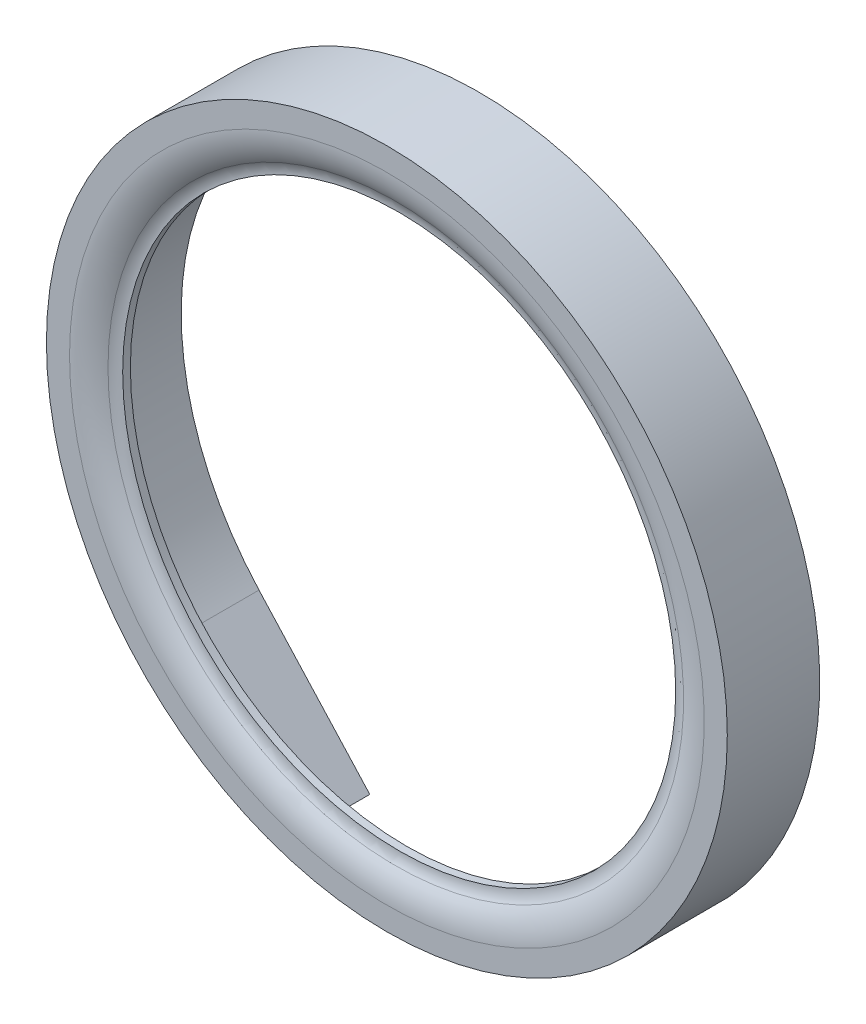
ISO-10303-21;
HEADER;
FILE_DESCRIPTION(('STEP AP214'),'2;1');
FILE_NAME('part.step','',(''),(''),'','','');
FILE_SCHEMA(('AUTOMOTIVE_DESIGN { 1 0 10303 214 1 1 1 1 }'));
ENDSEC;
DATA;
#1=APPLICATION_CONTEXT('core data for automotive mechanical design processes');
#2=APPLICATION_PROTOCOL_DEFINITION('international standard','automotive_design',2000,#1);
#3=PRODUCT_CONTEXT('',#1,'mechanical');
#4=PRODUCT('Part','Part','',(#3));
#5=PRODUCT_RELATED_PRODUCT_CATEGORY('part','',(#4));
#6=PRODUCT_DEFINITION_FORMATION('','',#4);
#7=PRODUCT_DEFINITION_CONTEXT('part definition',#1,'design');
#8=PRODUCT_DEFINITION('design','',#6,#7);
#9=PRODUCT_DEFINITION_SHAPE('','',#8);
#10=(LENGTH_UNIT() NAMED_UNIT(*) SI_UNIT(.MILLI.,.METRE.));
#11=(NAMED_UNIT(*) PLANE_ANGLE_UNIT() SI_UNIT($,.RADIAN.));
#12=(NAMED_UNIT(*) SI_UNIT($,.STERADIAN.) SOLID_ANGLE_UNIT());
#13=UNCERTAINTY_MEASURE_WITH_UNIT(LENGTH_MEASURE(1.E-05),#10,'distance_accuracy_value','');
#14=(GEOMETRIC_REPRESENTATION_CONTEXT(3) GLOBAL_UNCERTAINTY_ASSIGNED_CONTEXT((#13)) GLOBAL_UNIT_ASSIGNED_CONTEXT((#10,
#11,#12)) REPRESENTATION_CONTEXT('',''));
#15=CARTESIAN_POINT('',(0.,0.,0.));
#16=DIRECTION('',(0.,0.,1.));
#17=DIRECTION('',(1.,0.,0.));
#18=AXIS2_PLACEMENT_3D('',#15,#16,#17);
#19=CARTESIAN_POINT('',(0.,0.,2.82379327467158));
#20=DIRECTION('',(0.,0.,-1.));
#21=DIRECTION('',(-1.,0.,0.));
#22=AXIS2_PLACEMENT_3D('',#19,#20,#21);
#23=TOROIDAL_SURFACE('',#22,17.95,1.32379327467158);
#24=CARTESIAN_POINT('',(0.,0.,1.72113610330566));
#25=DIRECTION('',(0.,0.,-1.));
#26=DIRECTION('',(-1.,0.,0.));
#27=AXIS2_PLACEMENT_3D('',#24,#25,#26);
#28=CIRCLE('',#27,18.6825133422);
#29=CARTESIAN_POINT('',(-18.6825133422,0.,1.72113610330566));
#30=VERTEX_POINT('',#29);
#31=EDGE_CURVE('E116',#30,#30,#28,.T.);
#32=ORIENTED_EDGE('',*,*,#31,.F.);
#33=EDGE_LOOP('',(#32));
#34=FACE_BOUND('',#33,.T.);
#35=CARTESIAN_POINT('',(0.,0.,1.5));
#36=DIRECTION('',(0.,0.,-1.));
#37=DIRECTION('',(-1.,0.,0.));
#38=AXIS2_PLACEMENT_3D('',#35,#36,#37);
#39=CIRCLE('',#38,17.95);
#40=CARTESIAN_POINT('',(-17.95,0.,1.5));
#41=VERTEX_POINT('',#40);
#42=EDGE_CURVE('E129',#41,#41,#39,.T.);
#43=ORIENTED_EDGE('',*,*,#42,.T.);
#44=EDGE_LOOP('',(#43));
#45=FACE_BOUND('',#44,.T.);
#46=ADVANCED_FACE('F41',(#34,#45),#23,.F.);
#47=CARTESIAN_POINT('',(0.,0.,-23.2424672863447));
#48=DIRECTION('',(0.,0.,-1.));
#49=DIRECTION('',(-1.,0.,0.));
#50=AXIS2_PLACEMENT_3D('',#47,#48,#49);
#51=CYLINDRICAL_SURFACE('',#50,17.95);
#52=CARTESIAN_POINT('',(0.,0.,1.));
#53=DIRECTION('',(0.,0.,1.));
#54=DIRECTION('',(1.,0.,0.));
#55=AXIS2_PLACEMENT_3D('',#52,#53,#54);
#56=CIRCLE('',#55,17.95);
#57=CARTESIAN_POINT('',(17.95,0.,1.));
#58=VERTEX_POINT('',#57);
#59=EDGE_CURVE('E115',#58,#58,#56,.F.);
#60=ORIENTED_EDGE('',*,*,#59,.T.);
#61=EDGE_LOOP('',(#60));
#62=FACE_BOUND('',#61,.T.);
#63=ORIENTED_EDGE('',*,*,#42,.F.);
#64=EDGE_LOOP('',(#63));
#65=FACE_BOUND('',#64,.T.);
#66=ADVANCED_FACE('F151',(#62,#65),#51,.F.);
#67=CARTESIAN_POINT('',(17.95,0.,-3.7));
#68=DIRECTION('',(0.,0.,1.));
#69=DIRECTION('',(1.,0.,0.));
#70=AXIS2_PLACEMENT_3D('',#67,#68,#69);
#71=PLANE('',#70);
#72=CARTESIAN_POINT('',(-17.6236169670133,-10.1750000000001,-3.7));
#73=DIRECTION('',(0.,0.,-1.));
#74=DIRECTION('',(0.500000000000004,-0.866025403784436,0.));
#75=AXIS2_PLACEMENT_3D('',#72,#73,#74);
#76=CIRCLE('',#75,0.900000000000002);
#77=CARTESIAN_POINT('',(-17.1736169670133,-10.9544228634061,-3.7));
#78=VERTEX_POINT('',#77);
#79=EDGE_CURVE('E209',#78,#78,#76,.T.);
#80=ORIENTED_EDGE('',*,*,#79,.F.);
#81=EDGE_LOOP('',(#80));
#82=FACE_BOUND('',#81,.T.);
#83=CARTESIAN_POINT('',(17.6236169670134,-10.1749999999998,-3.7));
#84=DIRECTION('',(0.,0.,-1.));
#85=DIRECTION('',(0.499999999999992,0.866025403784443,0.));
#86=AXIS2_PLACEMENT_3D('',#83,#84,#85);
#87=CIRCLE('',#86,0.900000000000002);
#88=CARTESIAN_POINT('',(18.0736169670134,-9.39557713659384,-3.7));
#89=VERTEX_POINT('',#88);
#90=EDGE_CURVE('E216',#89,#89,#87,.T.);
#91=ORIENTED_EDGE('',*,*,#90,.F.);
#92=EDGE_LOOP('',(#91));
#93=FACE_BOUND('',#92,.T.);
#94=CARTESIAN_POINT('',(0.,20.35,-3.7));
#95=DIRECTION('',(0.,0.,-1.));
#96=DIRECTION('',(-1.,0.,0.));
#97=AXIS2_PLACEMENT_3D('',#94,#95,#96);
#98=CIRCLE('',#97,0.900000000000002);
#99=CARTESIAN_POINT('',(-0.900000000000002,20.35,-3.7));
#100=VERTEX_POINT('',#99);
#101=EDGE_CURVE('E105',#100,#100,#98,.T.);
#102=ORIENTED_EDGE('',*,*,#101,.F.);
#103=EDGE_LOOP('',(#102));
#104=FACE_BOUND('',#103,.T.);
#105=CARTESIAN_POINT('',(0.,0.,-3.7));
#106=DIRECTION('',(0.,0.,-1.));
#107=DIRECTION('',(-1.,0.,0.));
#108=AXIS2_PLACEMENT_3D('',#105,#106,#107);
#109=CIRCLE('',#108,22.1);
#110=CARTESIAN_POINT('',(-7.10764989868687,-20.9258527405145,-3.7));
#111=VERTEX_POINT('',#110);
#112=CARTESIAN_POINT('',(7.10764989868687,-20.9258527405145,-3.7));
#113=VERTEX_POINT('',#112);
#114=EDGE_CURVE('E123',#111,#113,#109,.T.);
#115=ORIENTED_EDGE('',*,*,#114,.T.);
#116=DIRECTION('',(0.673676781933663,0.739026111503176,0.));
#117=VECTOR('',#116,1.);
#118=CARTESIAN_POINT('',(4.75546722212209,-23.5062065000982,-3.7));
#119=LINE('',#118,#117);
#120=CARTESIAN_POINT('',(14.3001552575864,-13.0356457304164,-3.7));
#121=VERTEX_POINT('',#120);
#122=EDGE_CURVE('E89',#113,#121,#119,.T.);
#123=ORIENTED_EDGE('',*,*,#122,.T.);
#124=CARTESIAN_POINT('',(0.,0.,-3.7));
#125=DIRECTION('',(0.,0.,1.));
#126=DIRECTION('',(1.,0.,0.));
#127=AXIS2_PLACEMENT_3D('',#124,#125,#126);
#128=CIRCLE('',#127,19.35);
#129=CARTESIAN_POINT('',(-14.3001552575864,-13.0356457304164,-3.7));
#130=VERTEX_POINT('',#129);
#131=EDGE_CURVE('E110',#121,#130,#128,.T.);
#132=ORIENTED_EDGE('',*,*,#131,.T.);
#133=DIRECTION('',(0.673676781933663,-0.739026111503176,0.));
#134=VECTOR('',#133,1.);
#135=CARTESIAN_POINT('',(-14.3001552575864,-13.0356457304164,-3.7));
#136=LINE('',#135,#134);
#137=EDGE_CURVE('E84',#130,#111,#136,.T.);
#138=ORIENTED_EDGE('',*,*,#137,.T.);
#139=EDGE_LOOP('',(#115,#123,#132,#138));
#140=FACE_BOUND('',#139,.T.);
#141=ADVANCED_FACE('F136',(#82,#93,#104,#140),#71,.F.);
#142=CARTESIAN_POINT('',(0.,0.,-23.2424672863447));
#143=DIRECTION('',(0.,0.,-1.));
#144=DIRECTION('',(-1.,0.,0.));
#145=AXIS2_PLACEMENT_3D('',#142,#143,#144);
#146=CYLINDRICAL_SURFACE('',#145,22.1);
#147=CARTESIAN_POINT('',(0.,0.,1.));
#148=DIRECTION('',(0.,0.,1.));
#149=DIRECTION('',(1.,0.,0.));
#150=AXIS2_PLACEMENT_3D('',#147,#148,#149);
#151=CIRCLE('',#150,22.1);
#152=CARTESIAN_POINT('',(-7.10764989868687,-20.9258527405145,1.));
#153=VERTEX_POINT('',#152);
#154=CARTESIAN_POINT('',(7.10764989868687,-20.9258527405145,1.));
#155=VERTEX_POINT('',#154);
#156=EDGE_CURVE('E94',#153,#155,#151,.T.);
#157=ORIENTED_EDGE('',*,*,#156,.T.);
#158=DIRECTION('',(0.,0.,-1.));
#159=VECTOR('',#158,1.);
#160=CARTESIAN_POINT('',(7.10764989868686,-20.9258527405145,-23.2424672863447));
#161=LINE('',#160,#159);
#162=EDGE_CURVE('E11',#155,#113,#161,.T.);
#163=ORIENTED_EDGE('',*,*,#162,.T.);
#164=ORIENTED_EDGE('',*,*,#114,.F.);
#165=DIRECTION('',(0.,0.,-1.));
#166=VECTOR('',#165,1.);
#167=CARTESIAN_POINT('',(-7.10764989868686,-20.9258527405145,-23.2424672863447));
#168=LINE('',#167,#166);
#169=EDGE_CURVE('E48',#111,#153,#168,.F.);
#170=ORIENTED_EDGE('',*,*,#169,.T.);
#171=EDGE_LOOP('',(#157,#163,#164,#170));
#172=FACE_BOUND('',#171,.T.);
#173=CARTESIAN_POINT('',(0.,0.,2.3));
#174=DIRECTION('',(0.,0.,-1.));
#175=DIRECTION('',(-1.,0.,0.));
#176=AXIS2_PLACEMENT_3D('',#173,#174,#175);
#177=CIRCLE('',#176,22.1);
#178=CARTESIAN_POINT('',(-22.1,0.,2.3));
#179=VERTEX_POINT('',#178);
#180=EDGE_CURVE('E125',#179,#179,#177,.T.);
#181=ORIENTED_EDGE('',*,*,#180,.T.);
#182=EDGE_LOOP('',(#181));
#183=FACE_BOUND('',#182,.T.);
#184=ADVANCED_FACE('F131',(#172,#183),#146,.T.);
#185=CARTESIAN_POINT('',(22.1,0.,2.3));
#186=DIRECTION('',(0.,0.,-1.));
#187=DIRECTION('',(-1.,0.,0.));
#188=AXIS2_PLACEMENT_3D('',#185,#186,#187);
#189=PLANE('',#188);
#190=ORIENTED_EDGE('',*,*,#180,.F.);
#191=EDGE_LOOP('',(#190));
#192=FACE_BOUND('',#191,.T.);
#193=CARTESIAN_POINT('',(0.,0.,2.3));
#194=DIRECTION('',(0.,0.,-1.));
#195=DIRECTION('',(-1.,0.,0.));
#196=AXIS2_PLACEMENT_3D('',#193,#194,#195);
#197=CIRCLE('',#196,20.6);
#198=CARTESIAN_POINT('',(-20.6,0.,2.3));
#199=VERTEX_POINT('',#198);
#200=EDGE_CURVE('E118',#199,#199,#197,.T.);
#201=ORIENTED_EDGE('',*,*,#200,.T.);
#202=EDGE_LOOP('',(#201));
#203=FACE_BOUND('',#202,.T.);
#204=ADVANCED_FACE('F149',(#192,#203),#189,.F.);
#205=CARTESIAN_POINT('',(0.,0.,-1.16526922532842));
#206=DIRECTION('',(0.,0.,-1.));
#207=DIRECTION('',(-1.,0.,0.));
#208=AXIS2_PLACEMENT_3D('',#205,#206,#207);
#209=TOROIDAL_SURFACE('',#208,20.6,3.46526922532842);
#210=ORIENTED_EDGE('',*,*,#200,.F.);
#211=EDGE_LOOP('',(#210));
#212=FACE_BOUND('',#211,.T.);
#213=ORIENTED_EDGE('',*,*,#31,.T.);
#214=EDGE_LOOP('',(#213));
#215=FACE_BOUND('',#214,.T.);
#216=ADVANCED_FACE('F139',(#212,#215),#209,.T.);
#217=CARTESIAN_POINT('',(8.57390261115032,-19.3173676781934,-3.7));
#218=DIRECTION('',(0.739026111503176,-0.673676781933663,0.));
#219=DIRECTION('',(0.673676781933663,0.739026111503176,0.));
#220=AXIS2_PLACEMENT_3D('',#217,#218,#219);
#221=PLANE('',#220);
#222=DIRECTION('',(0.673676781933663,0.739026111503176,0.));
#223=VECTOR('',#222,1.);
#224=CARTESIAN_POINT('',(4.75546722212209,-23.5062065000982,1.));
#225=LINE('',#224,#223);
#226=CARTESIAN_POINT('',(14.3001552575864,-13.0356457304164,1.));
#227=VERTEX_POINT('',#226);
#228=EDGE_CURVE('E54',#155,#227,#225,.T.);
#229=ORIENTED_EDGE('',*,*,#228,.T.);
#230=DIRECTION('',(0.,0.,1.));
#231=VECTOR('',#230,1.);
#232=CARTESIAN_POINT('',(14.3001552575864,-13.0356457304164,-3.7));
#233=LINE('',#232,#231);
#234=EDGE_CURVE('E86',#121,#227,#233,.T.);
#235=ORIENTED_EDGE('',*,*,#234,.F.);
#236=ORIENTED_EDGE('',*,*,#122,.F.);
#237=ORIENTED_EDGE('',*,*,#162,.F.);
#238=EDGE_LOOP('',(#229,#235,#236,#237));
#239=FACE_BOUND('',#238,.T.);
#240=ADVANCED_FACE('F138',(#239),#221,.F.);
#241=CARTESIAN_POINT('',(-8.57390261115031,-19.3173676781934,-3.7));
#242=DIRECTION('',(-0.739026111503176,-0.673676781933663,0.));
#243=DIRECTION('',(0.673676781933663,-0.739026111503176,0.));
#244=AXIS2_PLACEMENT_3D('',#241,#242,#243);
#245=PLANE('',#244);
#246=ORIENTED_EDGE('',*,*,#137,.F.);
#247=DIRECTION('',(0.,0.,1.));
#248=VECTOR('',#247,1.);
#249=CARTESIAN_POINT('',(-14.3001552575864,-13.0356457304164,-3.7));
#250=LINE('',#249,#248);
#251=CARTESIAN_POINT('',(-14.3001552575864,-13.0356457304164,1.));
#252=VERTEX_POINT('',#251);
#253=EDGE_CURVE('E79',#130,#252,#250,.T.);
#254=ORIENTED_EDGE('',*,*,#253,.T.);
#255=DIRECTION('',(0.673676781933663,-0.739026111503176,0.));
#256=VECTOR('',#255,1.);
#257=CARTESIAN_POINT('',(-14.3001552575864,-13.0356457304164,1.));
#258=LINE('',#257,#256);
#259=EDGE_CURVE('E85',#252,#153,#258,.T.);
#260=ORIENTED_EDGE('',*,*,#259,.T.);
#261=ORIENTED_EDGE('',*,*,#169,.F.);
#262=EDGE_LOOP('',(#246,#254,#260,#261));
#263=FACE_BOUND('',#262,.T.);
#264=ADVANCED_FACE('F82',(#263),#245,.F.);
#265=CARTESIAN_POINT('',(0.,0.,1.));
#266=DIRECTION('',(0.,0.,1.));
#267=DIRECTION('',(1.,0.,0.));
#268=AXIS2_PLACEMENT_3D('',#265,#266,#267);
#269=PLANE('',#268);
#270=ORIENTED_EDGE('',*,*,#259,.F.);
#271=CARTESIAN_POINT('',(0.,0.,1.));
#272=DIRECTION('',(0.,0.,1.));
#273=DIRECTION('',(1.,0.,0.));
#274=AXIS2_PLACEMENT_3D('',#271,#272,#273);
#275=CIRCLE('',#274,19.35);
#276=EDGE_CURVE('E93',#227,#252,#275,.T.);
#277=ORIENTED_EDGE('',*,*,#276,.F.);
#278=ORIENTED_EDGE('',*,*,#228,.F.);
#279=ORIENTED_EDGE('',*,*,#156,.F.);
#280=EDGE_LOOP('',(#270,#277,#278,#279));
#281=FACE_BOUND('',#280,.T.);
#282=ORIENTED_EDGE('',*,*,#59,.F.);
#283=EDGE_LOOP('',(#282));
#284=FACE_BOUND('',#283,.T.);
#285=ADVANCED_FACE('F91',(#281,#284),#269,.F.);
#286=CARTESIAN_POINT('',(0.,0.,-3.7));
#287=DIRECTION('',(0.,0.,1.));
#288=DIRECTION('',(1.,0.,0.));
#289=AXIS2_PLACEMENT_3D('',#286,#287,#288);
#290=CYLINDRICAL_SURFACE('',#289,19.35);
#291=ORIENTED_EDGE('',*,*,#253,.F.);
#292=ORIENTED_EDGE('',*,*,#131,.F.);
#293=ORIENTED_EDGE('',*,*,#234,.T.);
#294=ORIENTED_EDGE('',*,*,#276,.T.);
#295=EDGE_LOOP('',(#291,#292,#293,#294));
#296=FACE_BOUND('',#295,.T.);
#297=ADVANCED_FACE('F96',(#296),#290,.F.);
#298=CARTESIAN_POINT('',(0.,20.35,0.3));
#299=DIRECTION('',(0.,0.,-1.));
#300=DIRECTION('',(-1.,0.,0.));
#301=AXIS2_PLACEMENT_3D('',#298,#299,#300);
#302=CYLINDRICAL_SURFACE('',#301,0.900000000000002);
#303=CARTESIAN_POINT('',(0.,20.35,0.3));
#304=DIRECTION('',(0.,0.,-1.));
#305=DIRECTION('',(-1.,0.,0.));
#306=AXIS2_PLACEMENT_3D('',#303,#304,#305);
#307=CIRCLE('',#306,0.900000000000002);
#308=CARTESIAN_POINT('',(-0.900000000000002,20.35,0.3));
#309=VERTEX_POINT('',#308);
#310=EDGE_CURVE('E100',#309,#309,#307,.T.);
#311=ORIENTED_EDGE('',*,*,#310,.F.);
#312=EDGE_LOOP('',(#311));
#313=FACE_BOUND('',#312,.T.);
#314=ORIENTED_EDGE('',*,*,#101,.T.);
#315=EDGE_LOOP('',(#314));
#316=FACE_BOUND('',#315,.T.);
#317=ADVANCED_FACE('F174',(#313,#316),#302,.F.);
#318=CARTESIAN_POINT('',(0.,20.35,0.3));
#319=DIRECTION('',(0.,0.,-1.));
#320=DIRECTION('',(-1.,0.,0.));
#321=AXIS2_PLACEMENT_3D('',#318,#319,#320);
#322=PLANE('',#321);
#323=ORIENTED_EDGE('',*,*,#310,.T.);
#324=EDGE_LOOP('',(#323));
#325=FACE_BOUND('',#324,.T.);
#326=ADVANCED_FACE('F179',(#325),#322,.T.);
#327=CARTESIAN_POINT('',(17.6236169670134,-10.1749999999998,0.3));
#328=DIRECTION('',(0.,0.,-1.));
#329=DIRECTION('',(-1.,0.,0.));
#330=AXIS2_PLACEMENT_3D('',#327,#328,#329);
#331=CYLINDRICAL_SURFACE('',#330,0.900000000000002);
#332=CARTESIAN_POINT('',(17.6236169670134,-10.1749999999998,0.3));
#333=DIRECTION('',(0.,0.,-1.));
#334=DIRECTION('',(0.499999999999992,0.866025403784443,0.));
#335=AXIS2_PLACEMENT_3D('',#332,#333,#334);
#336=CIRCLE('',#335,0.900000000000002);
#337=CARTESIAN_POINT('',(18.0736169670134,-9.39557713659384,0.3));
#338=VERTEX_POINT('',#337);
#339=EDGE_CURVE('E214',#338,#338,#336,.T.);
#340=ORIENTED_EDGE('',*,*,#339,.F.);
#341=EDGE_LOOP('',(#340));
#342=FACE_BOUND('',#341,.T.);
#343=ORIENTED_EDGE('',*,*,#90,.T.);
#344=EDGE_LOOP('',(#343));
#345=FACE_BOUND('',#344,.T.);
#346=ADVANCED_FACE('F189',(#342,#345),#331,.F.);
#347=CARTESIAN_POINT('',(17.6236169670134,-10.1749999999998,0.3));
#348=DIRECTION('',(0.,0.,-1.));
#349=DIRECTION('',(0.499999999999992,0.866025403784443,0.));
#350=AXIS2_PLACEMENT_3D('',#347,#348,#349);
#351=PLANE('',#350);
#352=ORIENTED_EDGE('',*,*,#339,.T.);
#353=EDGE_LOOP('',(#352));
#354=FACE_BOUND('',#353,.T.);
#355=ADVANCED_FACE('F195',(#354),#351,.T.);
#356=CARTESIAN_POINT('',(-17.6236169670133,-10.1750000000001,0.3));
#357=DIRECTION('',(0.,0.,-1.));
#358=DIRECTION('',(-1.,0.,0.));
#359=AXIS2_PLACEMENT_3D('',#356,#357,#358);
#360=CYLINDRICAL_SURFACE('',#359,0.900000000000002);
#361=CARTESIAN_POINT('',(-17.6236169670133,-10.1750000000001,0.3));
#362=DIRECTION('',(0.,0.,-1.));
#363=DIRECTION('',(0.500000000000004,-0.866025403784436,0.));
#364=AXIS2_PLACEMENT_3D('',#361,#362,#363);
#365=CIRCLE('',#364,0.900000000000002);
#366=CARTESIAN_POINT('',(-17.1736169670133,-10.9544228634061,0.3));
#367=VERTEX_POINT('',#366);
#368=EDGE_CURVE('E206',#367,#367,#365,.T.);
#369=ORIENTED_EDGE('',*,*,#368,.F.);
#370=EDGE_LOOP('',(#369));
#371=FACE_BOUND('',#370,.T.);
#372=ORIENTED_EDGE('',*,*,#79,.T.);
#373=EDGE_LOOP('',(#372));
#374=FACE_BOUND('',#373,.T.);
#375=ADVANCED_FACE('F198',(#371,#374),#360,.F.);
#376=CARTESIAN_POINT('',(-17.6236169670133,-10.1750000000001,0.3));
#377=DIRECTION('',(0.,0.,-1.));
#378=DIRECTION('',(0.500000000000004,-0.866025403784436,0.));
#379=AXIS2_PLACEMENT_3D('',#376,#377,#378);
#380=PLANE('',#379);
#381=ORIENTED_EDGE('',*,*,#368,.T.);
#382=EDGE_LOOP('',(#381));
#383=FACE_BOUND('',#382,.T.);
#384=ADVANCED_FACE('F197',(#383),#380,.T.);
#385=CLOSED_SHELL('',(#46,#66,#141,#184,#204,#216,#240,#264,#285,#297,#317,#326,#346,#355,#375,#384));
#386=MANIFOLD_SOLID_BREP('B2',#385);
#387=ADVANCED_BREP_SHAPE_REPRESENTATION('',(#18,#386),#14);
#388=SHAPE_DEFINITION_REPRESENTATION(#9,#387);
ENDSEC;
END-ISO-10303-21;
